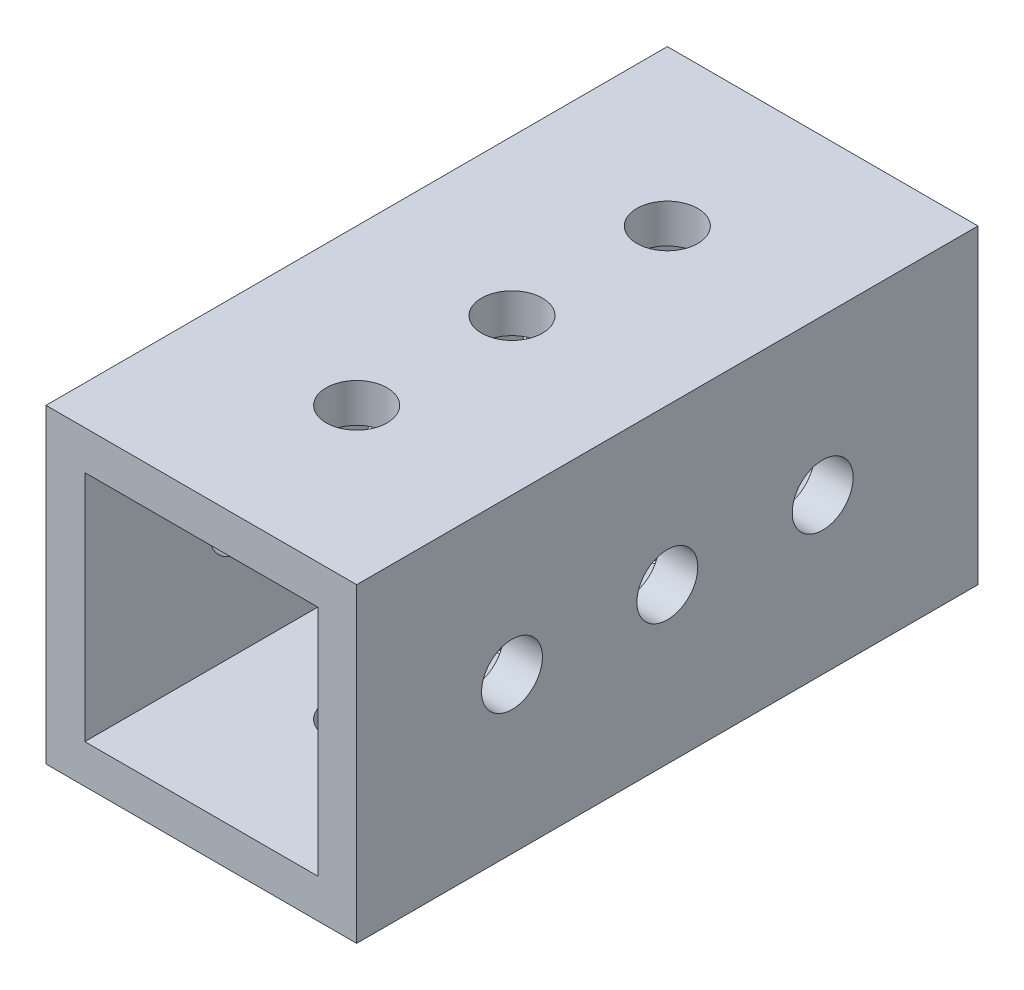
ISO-10303-21;
HEADER;
FILE_DESCRIPTION(('STEP AP214'),'2;1');
FILE_NAME('part.step','',(''),(''),'','','');
FILE_SCHEMA(('AUTOMOTIVE_DESIGN { 1 0 10303 214 1 1 1 1 }'));
ENDSEC;
DATA;
#1=APPLICATION_CONTEXT('core data for automotive mechanical design processes');
#2=APPLICATION_PROTOCOL_DEFINITION('international standard','automotive_design',2000,#1);
#3=PRODUCT_CONTEXT('',#1,'mechanical');
#4=PRODUCT('Part','Part','',(#3));
#5=PRODUCT_RELATED_PRODUCT_CATEGORY('part','',(#4));
#6=PRODUCT_DEFINITION_FORMATION('','',#4);
#7=PRODUCT_DEFINITION_CONTEXT('part definition',#1,'design');
#8=PRODUCT_DEFINITION('design','',#6,#7);
#9=PRODUCT_DEFINITION_SHAPE('','',#8);
#10=(LENGTH_UNIT() NAMED_UNIT(*) SI_UNIT(.MILLI.,.METRE.));
#11=(NAMED_UNIT(*) PLANE_ANGLE_UNIT() SI_UNIT($,.RADIAN.));
#12=(NAMED_UNIT(*) SI_UNIT($,.STERADIAN.) SOLID_ANGLE_UNIT());
#13=UNCERTAINTY_MEASURE_WITH_UNIT(LENGTH_MEASURE(1.E-05),#10,'distance_accuracy_value','');
#14=(GEOMETRIC_REPRESENTATION_CONTEXT(3) GLOBAL_UNCERTAINTY_ASSIGNED_CONTEXT((#13)) GLOBAL_UNIT_ASSIGNED_CONTEXT((#10,
#11,#12)) REPRESENTATION_CONTEXT('',''));
#15=CARTESIAN_POINT('',(0.,0.,0.));
#16=DIRECTION('',(0.,0.,1.));
#17=DIRECTION('',(1.,0.,0.));
#18=AXIS2_PLACEMENT_3D('',#15,#16,#17);
#19=CARTESIAN_POINT('',(139.7,169.926,-50.8));
#20=DIRECTION('',(-1.,0.,0.));
#21=DIRECTION('',(0.,0.,1.));
#22=AXIS2_PLACEMENT_3D('',#19,#20,#21);
#23=PLANE('',#22);
#24=CARTESIAN_POINT('',(139.7,157.226,-12.7));
#25=DIRECTION('',(1.,0.,0.));
#26=DIRECTION('',(0.,0.,-1.));
#27=AXIS2_PLACEMENT_3D('',#24,#25,#26);
#28=CIRCLE('',#27,2.48920000000001);
#29=CARTESIAN_POINT('',(139.7,157.226,-15.1892));
#30=VERTEX_POINT('',#29);
#31=EDGE_CURVE('E176',#30,#30,#28,.T.);
#32=ORIENTED_EDGE('',*,*,#31,.T.);
#33=EDGE_LOOP('',(#32));
#34=FACE_BOUND('',#33,.T.);
#35=CARTESIAN_POINT('',(139.7,157.226,-25.4));
#36=DIRECTION('',(1.,0.,0.));
#37=DIRECTION('',(0.,0.,-1.));
#38=AXIS2_PLACEMENT_3D('',#35,#36,#37);
#39=CIRCLE('',#38,2.48920000000001);
#40=CARTESIAN_POINT('',(139.7,157.226,-27.8892));
#41=VERTEX_POINT('',#40);
#42=EDGE_CURVE('E219',#41,#41,#39,.T.);
#43=ORIENTED_EDGE('',*,*,#42,.T.);
#44=EDGE_LOOP('',(#43));
#45=FACE_BOUND('',#44,.T.);
#46=CARTESIAN_POINT('',(139.7,157.226,-38.1));
#47=DIRECTION('',(1.,0.,0.));
#48=DIRECTION('',(0.,0.,-1.));
#49=AXIS2_PLACEMENT_3D('',#46,#47,#48);
#50=CIRCLE('',#49,2.48920000000001);
#51=CARTESIAN_POINT('',(139.7,157.226,-40.5892));
#52=VERTEX_POINT('',#51);
#53=EDGE_CURVE('E216',#52,#52,#50,.T.);
#54=ORIENTED_EDGE('',*,*,#53,.T.);
#55=EDGE_LOOP('',(#54));
#56=FACE_BOUND('',#55,.T.);
#57=DIRECTION('',(0.,-1.,0.));
#58=VECTOR('',#57,1.);
#59=CARTESIAN_POINT('',(139.7,169.926,0.));
#60=LINE('',#59,#58);
#61=CARTESIAN_POINT('',(139.7,169.926,0.));
#62=VERTEX_POINT('',#61);
#63=CARTESIAN_POINT('',(139.7,144.526,0.));
#64=VERTEX_POINT('',#63);
#65=EDGE_CURVE('E157',#62,#64,#60,.T.);
#66=ORIENTED_EDGE('',*,*,#65,.F.);
#67=DIRECTION('',(0.,0.,1.));
#68=VECTOR('',#67,1.);
#69=CARTESIAN_POINT('',(139.7,169.926,-50.8));
#70=LINE('',#69,#68);
#71=CARTESIAN_POINT('',(139.7,169.926,-50.8));
#72=VERTEX_POINT('',#71);
#73=EDGE_CURVE('E11',#72,#62,#70,.T.);
#74=ORIENTED_EDGE('',*,*,#73,.F.);
#75=DIRECTION('',(0.,-1.,0.));
#76=VECTOR('',#75,1.);
#77=CARTESIAN_POINT('',(139.7,169.926,-50.8));
#78=LINE('',#77,#76);
#79=CARTESIAN_POINT('',(139.7,144.526,-50.8));
#80=VERTEX_POINT('',#79);
#81=EDGE_CURVE('E143',#72,#80,#78,.T.);
#82=ORIENTED_EDGE('',*,*,#81,.T.);
#83=DIRECTION('',(0.,0.,1.));
#84=VECTOR('',#83,1.);
#85=CARTESIAN_POINT('',(139.7,144.526,-50.8));
#86=LINE('',#85,#84);
#87=EDGE_CURVE('E156',#80,#64,#86,.T.);
#88=ORIENTED_EDGE('',*,*,#87,.T.);
#89=EDGE_LOOP('',(#66,#74,#82,#88));
#90=FACE_BOUND('',#89,.T.);
#91=ADVANCED_FACE('F43',(#34,#45,#56,#90),#23,.T.);
#92=CARTESIAN_POINT('',(139.7,169.926,-50.8));
#93=DIRECTION('',(0.,1.,0.));
#94=DIRECTION('',(0.,0.,1.));
#95=AXIS2_PLACEMENT_3D('',#92,#93,#94);
#96=PLANE('',#95);
#97=CARTESIAN_POINT('',(152.4,169.926,-12.7));
#98=DIRECTION('',(0.,1.,0.));
#99=DIRECTION('',(0.,0.,1.));
#100=AXIS2_PLACEMENT_3D('',#97,#98,#99);
#101=CIRCLE('',#100,2.4892);
#102=CARTESIAN_POINT('',(152.4,169.926,-10.2108));
#103=VERTEX_POINT('',#102);
#104=EDGE_CURVE('E213',#103,#103,#101,.T.);
#105=ORIENTED_EDGE('',*,*,#104,.F.);
#106=EDGE_LOOP('',(#105));
#107=FACE_BOUND('',#106,.T.);
#108=CARTESIAN_POINT('',(152.4,169.926,-25.4));
#109=DIRECTION('',(0.,1.,0.));
#110=DIRECTION('',(0.,0.,1.));
#111=AXIS2_PLACEMENT_3D('',#108,#109,#110);
#112=CIRCLE('',#111,2.4892);
#113=CARTESIAN_POINT('',(152.4,169.926,-22.9108));
#114=VERTEX_POINT('',#113);
#115=EDGE_CURVE('E198',#114,#114,#112,.T.);
#116=ORIENTED_EDGE('',*,*,#115,.F.);
#117=EDGE_LOOP('',(#116));
#118=FACE_BOUND('',#117,.T.);
#119=CARTESIAN_POINT('',(152.4,169.926,-38.1));
#120=DIRECTION('',(0.,1.,0.));
#121=DIRECTION('',(0.,0.,1.));
#122=AXIS2_PLACEMENT_3D('',#119,#120,#121);
#123=CIRCLE('',#122,2.4892);
#124=CARTESIAN_POINT('',(152.4,169.926,-35.6108));
#125=VERTEX_POINT('',#124);
#126=EDGE_CURVE('E194',#125,#125,#123,.T.);
#127=ORIENTED_EDGE('',*,*,#126,.F.);
#128=EDGE_LOOP('',(#127));
#129=FACE_BOUND('',#128,.T.);
#130=DIRECTION('',(-1.,0.,0.));
#131=VECTOR('',#130,1.);
#132=CARTESIAN_POINT('',(139.7,169.926,0.));
#133=LINE('',#132,#131);
#134=CARTESIAN_POINT('',(165.1,169.926,0.));
#135=VERTEX_POINT('',#134);
#136=EDGE_CURVE('E147',#135,#62,#133,.T.);
#137=ORIENTED_EDGE('',*,*,#136,.F.);
#138=DIRECTION('',(0.,0.,1.));
#139=VECTOR('',#138,1.);
#140=CARTESIAN_POINT('',(165.1,169.926,-50.8));
#141=LINE('',#140,#139);
#142=CARTESIAN_POINT('',(165.1,169.926,-50.8));
#143=VERTEX_POINT('',#142);
#144=EDGE_CURVE('E51',#143,#135,#141,.T.);
#145=ORIENTED_EDGE('',*,*,#144,.F.);
#146=DIRECTION('',(-1.,0.,0.));
#147=VECTOR('',#146,1.);
#148=CARTESIAN_POINT('',(139.7,169.926,-50.8));
#149=LINE('',#148,#147);
#150=EDGE_CURVE('E153',#143,#72,#149,.T.);
#151=ORIENTED_EDGE('',*,*,#150,.T.);
#152=ORIENTED_EDGE('',*,*,#73,.T.);
#153=EDGE_LOOP('',(#137,#145,#151,#152));
#154=FACE_BOUND('',#153,.T.);
#155=ADVANCED_FACE('F260',(#107,#118,#129,#154),#96,.T.);
#156=CARTESIAN_POINT('',(165.1,169.926,-50.8));
#157=DIRECTION('',(1.,0.,0.));
#158=DIRECTION('',(0.,0.,-1.));
#159=AXIS2_PLACEMENT_3D('',#156,#157,#158);
#160=PLANE('',#159);
#161=CARTESIAN_POINT('',(165.1,157.226,-12.7));
#162=DIRECTION('',(1.,0.,0.));
#163=DIRECTION('',(0.,0.,-1.));
#164=AXIS2_PLACEMENT_3D('',#161,#162,#163);
#165=CIRCLE('',#164,2.48920000000001);
#166=CARTESIAN_POINT('',(165.1,157.226,-15.1892));
#167=VERTEX_POINT('',#166);
#168=EDGE_CURVE('E127',#167,#167,#165,.T.);
#169=ORIENTED_EDGE('',*,*,#168,.F.);
#170=EDGE_LOOP('',(#169));
#171=FACE_BOUND('',#170,.T.);
#172=CARTESIAN_POINT('',(165.1,157.226,-25.4));
#173=DIRECTION('',(1.,0.,0.));
#174=DIRECTION('',(0.,0.,-1.));
#175=AXIS2_PLACEMENT_3D('',#172,#173,#174);
#176=CIRCLE('',#175,2.48920000000001);
#177=CARTESIAN_POINT('',(165.1,157.226,-27.8892));
#178=VERTEX_POINT('',#177);
#179=EDGE_CURVE('E186',#178,#178,#176,.T.);
#180=ORIENTED_EDGE('',*,*,#179,.F.);
#181=EDGE_LOOP('',(#180));
#182=FACE_BOUND('',#181,.T.);
#183=CARTESIAN_POINT('',(165.1,157.226,-38.1));
#184=DIRECTION('',(1.,0.,0.));
#185=DIRECTION('',(0.,0.,-1.));
#186=AXIS2_PLACEMENT_3D('',#183,#184,#185);
#187=CIRCLE('',#186,2.48920000000001);
#188=CARTESIAN_POINT('',(165.1,157.226,-40.5892));
#189=VERTEX_POINT('',#188);
#190=EDGE_CURVE('E181',#189,#189,#187,.T.);
#191=ORIENTED_EDGE('',*,*,#190,.F.);
#192=EDGE_LOOP('',(#191));
#193=FACE_BOUND('',#192,.T.);
#194=DIRECTION('',(0.,1.,0.));
#195=VECTOR('',#194,1.);
#196=CARTESIAN_POINT('',(165.1,169.926,0.));
#197=LINE('',#196,#195);
#198=CARTESIAN_POINT('',(165.1,144.526,0.));
#199=VERTEX_POINT('',#198);
#200=EDGE_CURVE('E163',#199,#135,#197,.T.);
#201=ORIENTED_EDGE('',*,*,#200,.F.);
#202=DIRECTION('',(0.,0.,1.));
#203=VECTOR('',#202,1.);
#204=CARTESIAN_POINT('',(165.1,144.526,-50.8));
#205=LINE('',#204,#203);
#206=CARTESIAN_POINT('',(165.1,144.526,-50.8));
#207=VERTEX_POINT('',#206);
#208=EDGE_CURVE('E169',#207,#199,#205,.T.);
#209=ORIENTED_EDGE('',*,*,#208,.F.);
#210=DIRECTION('',(0.,1.,0.));
#211=VECTOR('',#210,1.);
#212=CARTESIAN_POINT('',(165.1,169.926,-50.8));
#213=LINE('',#212,#211);
#214=EDGE_CURVE('E150',#207,#143,#213,.T.);
#215=ORIENTED_EDGE('',*,*,#214,.T.);
#216=ORIENTED_EDGE('',*,*,#144,.T.);
#217=EDGE_LOOP('',(#201,#209,#215,#216));
#218=FACE_BOUND('',#217,.T.);
#219=ADVANCED_FACE('F267',(#171,#182,#193,#218),#160,.T.);
#220=CARTESIAN_POINT('',(139.7,144.526,-50.8));
#221=DIRECTION('',(0.,-1.,0.));
#222=DIRECTION('',(0.,0.,-1.));
#223=AXIS2_PLACEMENT_3D('',#220,#221,#222);
#224=PLANE('',#223);
#225=CARTESIAN_POINT('',(152.4,144.526,-12.7));
#226=DIRECTION('',(0.,1.,0.));
#227=DIRECTION('',(0.,0.,1.));
#228=AXIS2_PLACEMENT_3D('',#225,#226,#227);
#229=CIRCLE('',#228,2.4892);
#230=CARTESIAN_POINT('',(152.4,144.526,-10.2108));
#231=VERTEX_POINT('',#230);
#232=EDGE_CURVE('E190',#231,#231,#229,.T.);
#233=ORIENTED_EDGE('',*,*,#232,.T.);
#234=EDGE_LOOP('',(#233));
#235=FACE_BOUND('',#234,.T.);
#236=CARTESIAN_POINT('',(152.4,144.526,-25.4));
#237=DIRECTION('',(0.,1.,0.));
#238=DIRECTION('',(0.,0.,1.));
#239=AXIS2_PLACEMENT_3D('',#236,#237,#238);
#240=CIRCLE('',#239,2.4892);
#241=CARTESIAN_POINT('',(152.4,144.526,-22.9108));
#242=VERTEX_POINT('',#241);
#243=EDGE_CURVE('E504',#242,#242,#240,.T.);
#244=ORIENTED_EDGE('',*,*,#243,.T.);
#245=EDGE_LOOP('',(#244));
#246=FACE_BOUND('',#245,.T.);
#247=CARTESIAN_POINT('',(152.4,144.526,-38.1));
#248=DIRECTION('',(0.,1.,0.));
#249=DIRECTION('',(0.,0.,1.));
#250=AXIS2_PLACEMENT_3D('',#247,#248,#249);
#251=CIRCLE('',#250,2.4892);
#252=CARTESIAN_POINT('',(152.4,144.526,-35.6108));
#253=VERTEX_POINT('',#252);
#254=EDGE_CURVE('E507',#253,#253,#251,.T.);
#255=ORIENTED_EDGE('',*,*,#254,.T.);
#256=EDGE_LOOP('',(#255));
#257=FACE_BOUND('',#256,.T.);
#258=DIRECTION('',(1.,0.,0.));
#259=VECTOR('',#258,1.);
#260=CARTESIAN_POINT('',(139.7,144.526,0.));
#261=LINE('',#260,#259);
#262=EDGE_CURVE('E160',#64,#199,#261,.T.);
#263=ORIENTED_EDGE('',*,*,#262,.F.);
#264=ORIENTED_EDGE('',*,*,#87,.F.);
#265=DIRECTION('',(1.,0.,0.));
#266=VECTOR('',#265,1.);
#267=CARTESIAN_POINT('',(139.7,144.526,-50.8));
#268=LINE('',#267,#266);
#269=EDGE_CURVE('E146',#80,#207,#268,.T.);
#270=ORIENTED_EDGE('',*,*,#269,.T.);
#271=ORIENTED_EDGE('',*,*,#208,.T.);
#272=EDGE_LOOP('',(#263,#264,#270,#271));
#273=FACE_BOUND('',#272,.T.);
#274=ADVANCED_FACE('F286',(#235,#246,#257,#273),#224,.T.);
#275=CARTESIAN_POINT('',(0.,0.,-50.8));
#276=DIRECTION('',(0.,0.,1.));
#277=DIRECTION('',(1.,0.,0.));
#278=AXIS2_PLACEMENT_3D('',#275,#276,#277);
#279=PLANE('',#278);
#280=DIRECTION('',(-1.,0.,0.));
#281=VECTOR('',#280,1.);
#282=CARTESIAN_POINT('',(0.,166.751,-50.8));
#283=LINE('',#282,#281);
#284=CARTESIAN_POINT('',(161.925,166.751,-50.8));
#285=VERTEX_POINT('',#284);
#286=CARTESIAN_POINT('',(142.875,166.751,-50.8));
#287=VERTEX_POINT('',#286);
#288=EDGE_CURVE('E118',#285,#287,#283,.T.);
#289=ORIENTED_EDGE('',*,*,#288,.T.);
#290=DIRECTION('',(0.,-1.,0.));
#291=VECTOR('',#290,1.);
#292=CARTESIAN_POINT('',(142.875,0.,-50.8));
#293=LINE('',#292,#291);
#294=CARTESIAN_POINT('',(142.875,147.701,-50.8));
#295=VERTEX_POINT('',#294);
#296=EDGE_CURVE('E137',#287,#295,#293,.T.);
#297=ORIENTED_EDGE('',*,*,#296,.T.);
#298=DIRECTION('',(1.,0.,0.));
#299=VECTOR('',#298,1.);
#300=CARTESIAN_POINT('',(0.,147.701,-50.8));
#301=LINE('',#300,#299);
#302=CARTESIAN_POINT('',(161.925,147.701,-50.8));
#303=VERTEX_POINT('',#302);
#304=EDGE_CURVE('E113',#295,#303,#301,.T.);
#305=ORIENTED_EDGE('',*,*,#304,.T.);
#306=DIRECTION('',(0.,1.,0.));
#307=VECTOR('',#306,1.);
#308=CARTESIAN_POINT('',(161.925,0.,-50.8));
#309=LINE('',#308,#307);
#310=EDGE_CURVE('E59',#303,#285,#309,.T.);
#311=ORIENTED_EDGE('',*,*,#310,.T.);
#312=EDGE_LOOP('',(#289,#297,#305,#311));
#313=FACE_BOUND('',#312,.T.);
#314=ORIENTED_EDGE('',*,*,#81,.F.);
#315=ORIENTED_EDGE('',*,*,#150,.F.);
#316=ORIENTED_EDGE('',*,*,#214,.F.);
#317=ORIENTED_EDGE('',*,*,#269,.F.);
#318=EDGE_LOOP('',(#314,#315,#316,#317));
#319=FACE_BOUND('',#318,.T.);
#320=ADVANCED_FACE('F240',(#313,#319),#279,.F.);
#321=CARTESIAN_POINT('',(0.,0.,0.));
#322=DIRECTION('',(0.,0.,1.));
#323=DIRECTION('',(1.,0.,0.));
#324=AXIS2_PLACEMENT_3D('',#321,#322,#323);
#325=PLANE('',#324);
#326=DIRECTION('',(0.,-1.,0.));
#327=VECTOR('',#326,1.);
#328=CARTESIAN_POINT('',(142.875,0.,0.));
#329=LINE('',#328,#327);
#330=CARTESIAN_POINT('',(142.875,166.751,0.));
#331=VERTEX_POINT('',#330);
#332=CARTESIAN_POINT('',(142.875,147.701,0.));
#333=VERTEX_POINT('',#332);
#334=EDGE_CURVE('E121',#331,#333,#329,.T.);
#335=ORIENTED_EDGE('',*,*,#334,.F.);
#336=DIRECTION('',(-1.,0.,0.));
#337=VECTOR('',#336,1.);
#338=CARTESIAN_POINT('',(0.,166.751,0.));
#339=LINE('',#338,#337);
#340=CARTESIAN_POINT('',(161.925,166.751,0.));
#341=VERTEX_POINT('',#340);
#342=EDGE_CURVE('E132',#341,#331,#339,.T.);
#343=ORIENTED_EDGE('',*,*,#342,.F.);
#344=DIRECTION('',(0.,1.,0.));
#345=VECTOR('',#344,1.);
#346=CARTESIAN_POINT('',(161.925,0.,0.));
#347=LINE('',#346,#345);
#348=CARTESIAN_POINT('',(161.925,147.701,0.));
#349=VERTEX_POINT('',#348);
#350=EDGE_CURVE('E64',#349,#341,#347,.T.);
#351=ORIENTED_EDGE('',*,*,#350,.F.);
#352=DIRECTION('',(1.,0.,0.));
#353=VECTOR('',#352,1.);
#354=CARTESIAN_POINT('',(0.,147.701,0.));
#355=LINE('',#354,#353);
#356=EDGE_CURVE('E111',#333,#349,#355,.T.);
#357=ORIENTED_EDGE('',*,*,#356,.F.);
#358=EDGE_LOOP('',(#335,#343,#351,#357));
#359=FACE_BOUND('',#358,.T.);
#360=ORIENTED_EDGE('',*,*,#65,.T.);
#361=ORIENTED_EDGE('',*,*,#262,.T.);
#362=ORIENTED_EDGE('',*,*,#200,.T.);
#363=ORIENTED_EDGE('',*,*,#136,.T.);
#364=EDGE_LOOP('',(#360,#361,#362,#363));
#365=FACE_BOUND('',#364,.T.);
#366=ADVANCED_FACE('F129',(#359,#365),#325,.T.);
#367=CARTESIAN_POINT('',(142.875,169.926,-50.8));
#368=DIRECTION('',(-1.,0.,0.));
#369=DIRECTION('',(0.,0.,1.));
#370=AXIS2_PLACEMENT_3D('',#367,#368,#369);
#371=PLANE('',#370);
#372=CARTESIAN_POINT('',(142.875,157.226,-12.7));
#373=DIRECTION('',(-1.,0.,0.));
#374=DIRECTION('',(0.,0.,1.));
#375=AXIS2_PLACEMENT_3D('',#372,#373,#374);
#376=CIRCLE('',#375,2.48920000000001);
#377=CARTESIAN_POINT('',(142.875,157.226,-10.2108));
#378=VERTEX_POINT('',#377);
#379=EDGE_CURVE('E185',#378,#378,#376,.T.);
#380=ORIENTED_EDGE('',*,*,#379,.T.);
#381=EDGE_LOOP('',(#380));
#382=FACE_BOUND('',#381,.T.);
#383=CARTESIAN_POINT('',(142.875,157.226,-25.4));
#384=DIRECTION('',(-1.,0.,0.));
#385=DIRECTION('',(0.,0.,1.));
#386=AXIS2_PLACEMENT_3D('',#383,#384,#385);
#387=CIRCLE('',#386,2.48920000000001);
#388=CARTESIAN_POINT('',(142.875,157.226,-22.9108));
#389=VERTEX_POINT('',#388);
#390=EDGE_CURVE('E180',#389,#389,#387,.T.);
#391=ORIENTED_EDGE('',*,*,#390,.T.);
#392=EDGE_LOOP('',(#391));
#393=FACE_BOUND('',#392,.T.);
#394=CARTESIAN_POINT('',(142.875,157.226,-38.1));
#395=DIRECTION('',(-1.,0.,0.));
#396=DIRECTION('',(0.,0.,1.));
#397=AXIS2_PLACEMENT_3D('',#394,#395,#396);
#398=CIRCLE('',#397,2.48920000000001);
#399=CARTESIAN_POINT('',(142.875,157.226,-35.6108));
#400=VERTEX_POINT('',#399);
#401=EDGE_CURVE('E175',#400,#400,#398,.T.);
#402=ORIENTED_EDGE('',*,*,#401,.T.);
#403=EDGE_LOOP('',(#402));
#404=FACE_BOUND('',#403,.T.);
#405=ORIENTED_EDGE('',*,*,#334,.T.);
#406=DIRECTION('',(0.,0.,1.));
#407=VECTOR('',#406,1.);
#408=CARTESIAN_POINT('',(142.875,147.701,-50.8));
#409=LINE('',#408,#407);
#410=EDGE_CURVE('E107',#295,#333,#409,.T.);
#411=ORIENTED_EDGE('',*,*,#410,.F.);
#412=ORIENTED_EDGE('',*,*,#296,.F.);
#413=DIRECTION('',(0.,0.,1.));
#414=VECTOR('',#413,1.);
#415=CARTESIAN_POINT('',(142.875,166.751,-50.8));
#416=LINE('',#415,#414);
#417=EDGE_CURVE('E123',#287,#331,#416,.T.);
#418=ORIENTED_EDGE('',*,*,#417,.T.);
#419=EDGE_LOOP('',(#405,#411,#412,#418));
#420=FACE_BOUND('',#419,.T.);
#421=ADVANCED_FACE('F122',(#382,#393,#404,#420),#371,.F.);
#422=CARTESIAN_POINT('',(139.7,166.751,-50.8));
#423=DIRECTION('',(0.,1.,0.));
#424=DIRECTION('',(0.,0.,1.));
#425=AXIS2_PLACEMENT_3D('',#422,#423,#424);
#426=PLANE('',#425);
#427=CARTESIAN_POINT('',(152.4,166.751,-12.7));
#428=DIRECTION('',(0.,1.,0.));
#429=DIRECTION('',(0.,0.,1.));
#430=AXIS2_PLACEMENT_3D('',#427,#428,#429);
#431=CIRCLE('',#430,2.4892);
#432=CARTESIAN_POINT('',(152.4,166.751,-10.2108));
#433=VERTEX_POINT('',#432);
#434=EDGE_CURVE('E210',#433,#433,#431,.T.);
#435=ORIENTED_EDGE('',*,*,#434,.T.);
#436=EDGE_LOOP('',(#435));
#437=FACE_BOUND('',#436,.T.);
#438=CARTESIAN_POINT('',(152.4,166.751,-25.4));
#439=DIRECTION('',(0.,1.,0.));
#440=DIRECTION('',(0.,0.,1.));
#441=AXIS2_PLACEMENT_3D('',#438,#439,#440);
#442=CIRCLE('',#441,2.4892);
#443=CARTESIAN_POINT('',(152.4,166.751,-22.9108));
#444=VERTEX_POINT('',#443);
#445=EDGE_CURVE('E193',#444,#444,#442,.T.);
#446=ORIENTED_EDGE('',*,*,#445,.T.);
#447=EDGE_LOOP('',(#446));
#448=FACE_BOUND('',#447,.T.);
#449=CARTESIAN_POINT('',(152.4,166.751,-38.1));
#450=DIRECTION('',(0.,1.,0.));
#451=DIRECTION('',(0.,0.,1.));
#452=AXIS2_PLACEMENT_3D('',#449,#450,#451);
#453=CIRCLE('',#452,2.4892);
#454=CARTESIAN_POINT('',(152.4,166.751,-35.6108));
#455=VERTEX_POINT('',#454);
#456=EDGE_CURVE('E189',#455,#455,#453,.T.);
#457=ORIENTED_EDGE('',*,*,#456,.T.);
#458=EDGE_LOOP('',(#457));
#459=FACE_BOUND('',#458,.T.);
#460=ORIENTED_EDGE('',*,*,#342,.T.);
#461=ORIENTED_EDGE('',*,*,#417,.F.);
#462=ORIENTED_EDGE('',*,*,#288,.F.);
#463=DIRECTION('',(0.,0.,1.));
#464=VECTOR('',#463,1.);
#465=CARTESIAN_POINT('',(161.925,166.751,-50.8));
#466=LINE('',#465,#464);
#467=EDGE_CURVE('E236',#285,#341,#466,.T.);
#468=ORIENTED_EDGE('',*,*,#467,.T.);
#469=EDGE_LOOP('',(#460,#461,#462,#468));
#470=FACE_BOUND('',#469,.T.);
#471=ADVANCED_FACE('F244',(#437,#448,#459,#470),#426,.F.);
#472=CARTESIAN_POINT('',(161.925,169.926,-50.8));
#473=DIRECTION('',(1.,0.,0.));
#474=DIRECTION('',(0.,0.,-1.));
#475=AXIS2_PLACEMENT_3D('',#472,#473,#474);
#476=PLANE('',#475);
#477=CARTESIAN_POINT('',(161.925,157.226,-12.7));
#478=DIRECTION('',(1.,0.,0.));
#479=DIRECTION('',(0.,0.,-1.));
#480=AXIS2_PLACEMENT_3D('',#477,#478,#479);
#481=CIRCLE('',#480,2.48920000000001);
#482=CARTESIAN_POINT('',(161.925,157.226,-15.1892));
#483=VERTEX_POINT('',#482);
#484=EDGE_CURVE('E182',#483,#483,#481,.T.);
#485=ORIENTED_EDGE('',*,*,#484,.T.);
#486=EDGE_LOOP('',(#485));
#487=FACE_BOUND('',#486,.T.);
#488=CARTESIAN_POINT('',(161.925,157.226,-25.4));
#489=DIRECTION('',(1.,0.,0.));
#490=DIRECTION('',(0.,0.,-1.));
#491=AXIS2_PLACEMENT_3D('',#488,#489,#490);
#492=CIRCLE('',#491,2.48920000000001);
#493=CARTESIAN_POINT('',(161.925,157.226,-27.8892));
#494=VERTEX_POINT('',#493);
#495=EDGE_CURVE('E177',#494,#494,#492,.T.);
#496=ORIENTED_EDGE('',*,*,#495,.T.);
#497=EDGE_LOOP('',(#496));
#498=FACE_BOUND('',#497,.T.);
#499=CARTESIAN_POINT('',(161.925,157.226,-38.1));
#500=DIRECTION('',(1.,0.,0.));
#501=DIRECTION('',(0.,0.,-1.));
#502=AXIS2_PLACEMENT_3D('',#499,#500,#501);
#503=CIRCLE('',#502,2.48920000000001);
#504=CARTESIAN_POINT('',(161.925,157.226,-40.5892));
#505=VERTEX_POINT('',#504);
#506=EDGE_CURVE('E172',#505,#505,#503,.T.);
#507=ORIENTED_EDGE('',*,*,#506,.T.);
#508=EDGE_LOOP('',(#507));
#509=FACE_BOUND('',#508,.T.);
#510=ORIENTED_EDGE('',*,*,#350,.T.);
#511=ORIENTED_EDGE('',*,*,#467,.F.);
#512=ORIENTED_EDGE('',*,*,#310,.F.);
#513=DIRECTION('',(0.,0.,1.));
#514=VECTOR('',#513,1.);
#515=CARTESIAN_POINT('',(161.925,147.701,-50.8));
#516=LINE('',#515,#514);
#517=EDGE_CURVE('E117',#303,#349,#516,.T.);
#518=ORIENTED_EDGE('',*,*,#517,.T.);
#519=EDGE_LOOP('',(#510,#511,#512,#518));
#520=FACE_BOUND('',#519,.T.);
#521=ADVANCED_FACE('F238',(#487,#498,#509,#520),#476,.F.);
#522=CARTESIAN_POINT('',(139.7,147.701,-50.8));
#523=DIRECTION('',(0.,-1.,0.));
#524=DIRECTION('',(0.,0.,-1.));
#525=AXIS2_PLACEMENT_3D('',#522,#523,#524);
#526=PLANE('',#525);
#527=CARTESIAN_POINT('',(152.4,147.701,-12.7));
#528=DIRECTION('',(0.,-1.,0.));
#529=DIRECTION('',(0.,0.,-1.));
#530=AXIS2_PLACEMENT_3D('',#527,#528,#529);
#531=CIRCLE('',#530,2.4892);
#532=CARTESIAN_POINT('',(152.4,147.701,-15.1892));
#533=VERTEX_POINT('',#532);
#534=EDGE_CURVE('E46',#533,#533,#531,.T.);
#535=ORIENTED_EDGE('',*,*,#534,.T.);
#536=EDGE_LOOP('',(#535));
#537=FACE_BOUND('',#536,.T.);
#538=CARTESIAN_POINT('',(152.4,147.701,-25.4));
#539=DIRECTION('',(0.,-1.,0.));
#540=DIRECTION('',(0.,0.,-1.));
#541=AXIS2_PLACEMENT_3D('',#538,#539,#540);
#542=CIRCLE('',#541,2.4892);
#543=CARTESIAN_POINT('',(152.4,147.701,-27.8892));
#544=VERTEX_POINT('',#543);
#545=EDGE_CURVE('E191',#544,#544,#542,.T.);
#546=ORIENTED_EDGE('',*,*,#545,.T.);
#547=EDGE_LOOP('',(#546));
#548=FACE_BOUND('',#547,.T.);
#549=CARTESIAN_POINT('',(152.4,147.701,-38.1));
#550=DIRECTION('',(0.,-1.,0.));
#551=DIRECTION('',(0.,0.,-1.));
#552=AXIS2_PLACEMENT_3D('',#549,#550,#551);
#553=CIRCLE('',#552,2.4892);
#554=CARTESIAN_POINT('',(152.4,147.701,-40.5892));
#555=VERTEX_POINT('',#554);
#556=EDGE_CURVE('E187',#555,#555,#553,.T.);
#557=ORIENTED_EDGE('',*,*,#556,.T.);
#558=EDGE_LOOP('',(#557));
#559=FACE_BOUND('',#558,.T.);
#560=ORIENTED_EDGE('',*,*,#356,.T.);
#561=ORIENTED_EDGE('',*,*,#517,.F.);
#562=ORIENTED_EDGE('',*,*,#304,.F.);
#563=ORIENTED_EDGE('',*,*,#410,.T.);
#564=EDGE_LOOP('',(#560,#561,#562,#563));
#565=FACE_BOUND('',#564,.T.);
#566=ADVANCED_FACE('F109',(#537,#548,#559,#565),#526,.F.);
#567=CARTESIAN_POINT('',(139.7,157.226,-38.1));
#568=DIRECTION('',(1.,0.,0.));
#569=DIRECTION('',(0.,0.,-1.));
#570=AXIS2_PLACEMENT_3D('',#567,#568,#569);
#571=CYLINDRICAL_SURFACE('',#570,2.48920000000001);
#572=ORIENTED_EDGE('',*,*,#190,.T.);
#573=EDGE_LOOP('',(#572));
#574=FACE_BOUND('',#573,.T.);
#575=ORIENTED_EDGE('',*,*,#506,.F.);
#576=EDGE_LOOP('',(#575));
#577=FACE_BOUND('',#576,.T.);
#578=ADVANCED_FACE('F299',(#574,#577),#571,.F.);
#579=CARTESIAN_POINT('',(139.7,157.226,-25.4));
#580=DIRECTION('',(1.,0.,0.));
#581=DIRECTION('',(0.,0.,-1.));
#582=AXIS2_PLACEMENT_3D('',#579,#580,#581);
#583=CYLINDRICAL_SURFACE('',#582,2.48920000000001);
#584=ORIENTED_EDGE('',*,*,#179,.T.);
#585=EDGE_LOOP('',(#584));
#586=FACE_BOUND('',#585,.T.);
#587=ORIENTED_EDGE('',*,*,#495,.F.);
#588=EDGE_LOOP('',(#587));
#589=FACE_BOUND('',#588,.T.);
#590=ADVANCED_FACE('F305',(#586,#589),#583,.F.);
#591=CARTESIAN_POINT('',(139.7,157.226,-12.7));
#592=DIRECTION('',(1.,0.,0.));
#593=DIRECTION('',(0.,0.,-1.));
#594=AXIS2_PLACEMENT_3D('',#591,#592,#593);
#595=CYLINDRICAL_SURFACE('',#594,2.48920000000001);
#596=ORIENTED_EDGE('',*,*,#168,.T.);
#597=EDGE_LOOP('',(#596));
#598=FACE_BOUND('',#597,.T.);
#599=ORIENTED_EDGE('',*,*,#484,.F.);
#600=EDGE_LOOP('',(#599));
#601=FACE_BOUND('',#600,.T.);
#602=ADVANCED_FACE('F331',(#598,#601),#595,.F.);
#603=ORIENTED_EDGE('',*,*,#53,.F.);
#604=EDGE_LOOP('',(#603));
#605=FACE_BOUND('',#604,.T.);
#606=ORIENTED_EDGE('',*,*,#401,.F.);
#607=EDGE_LOOP('',(#606));
#608=FACE_BOUND('',#607,.T.);
#609=ADVANCED_FACE('F308',(#605,#608),#571,.F.);
#610=ORIENTED_EDGE('',*,*,#42,.F.);
#611=EDGE_LOOP('',(#610));
#612=FACE_BOUND('',#611,.T.);
#613=ORIENTED_EDGE('',*,*,#390,.F.);
#614=EDGE_LOOP('',(#613));
#615=FACE_BOUND('',#614,.T.);
#616=ADVANCED_FACE('F328',(#612,#615),#583,.F.);
#617=ORIENTED_EDGE('',*,*,#31,.F.);
#618=EDGE_LOOP('',(#617));
#619=FACE_BOUND('',#618,.T.);
#620=ORIENTED_EDGE('',*,*,#379,.F.);
#621=EDGE_LOOP('',(#620));
#622=FACE_BOUND('',#621,.T.);
#623=ADVANCED_FACE('F316',(#619,#622),#595,.F.);
#624=CARTESIAN_POINT('',(152.4,144.526,-38.1));
#625=DIRECTION('',(0.,1.,0.));
#626=DIRECTION('',(0.,0.,1.));
#627=AXIS2_PLACEMENT_3D('',#624,#625,#626);
#628=CYLINDRICAL_SURFACE('',#627,2.4892);
#629=ORIENTED_EDGE('',*,*,#254,.F.);
#630=EDGE_LOOP('',(#629));
#631=FACE_BOUND('',#630,.T.);
#632=ORIENTED_EDGE('',*,*,#556,.F.);
#633=EDGE_LOOP('',(#632));
#634=FACE_BOUND('',#633,.T.);
#635=ADVANCED_FACE('F314',(#631,#634),#628,.F.);
#636=CARTESIAN_POINT('',(152.4,144.526,-25.4));
#637=DIRECTION('',(0.,1.,0.));
#638=DIRECTION('',(0.,0.,1.));
#639=AXIS2_PLACEMENT_3D('',#636,#637,#638);
#640=CYLINDRICAL_SURFACE('',#639,2.4892);
#641=ORIENTED_EDGE('',*,*,#243,.F.);
#642=EDGE_LOOP('',(#641));
#643=FACE_BOUND('',#642,.T.);
#644=ORIENTED_EDGE('',*,*,#545,.F.);
#645=EDGE_LOOP('',(#644));
#646=FACE_BOUND('',#645,.T.);
#647=ADVANCED_FACE('F315',(#643,#646),#640,.F.);
#648=CARTESIAN_POINT('',(152.4,144.526,-12.7));
#649=DIRECTION('',(0.,1.,0.));
#650=DIRECTION('',(0.,0.,1.));
#651=AXIS2_PLACEMENT_3D('',#648,#649,#650);
#652=CYLINDRICAL_SURFACE('',#651,2.4892);
#653=ORIENTED_EDGE('',*,*,#232,.F.);
#654=EDGE_LOOP('',(#653));
#655=FACE_BOUND('',#654,.T.);
#656=ORIENTED_EDGE('',*,*,#534,.F.);
#657=EDGE_LOOP('',(#656));
#658=FACE_BOUND('',#657,.T.);
#659=ADVANCED_FACE('F323',(#655,#658),#652,.F.);
#660=ORIENTED_EDGE('',*,*,#126,.T.);
#661=EDGE_LOOP('',(#660));
#662=FACE_BOUND('',#661,.T.);
#663=ORIENTED_EDGE('',*,*,#456,.F.);
#664=EDGE_LOOP('',(#663));
#665=FACE_BOUND('',#664,.T.);
#666=ADVANCED_FACE('F319',(#662,#665),#628,.F.);
#667=ORIENTED_EDGE('',*,*,#115,.T.);
#668=EDGE_LOOP('',(#667));
#669=FACE_BOUND('',#668,.T.);
#670=ORIENTED_EDGE('',*,*,#445,.F.);
#671=EDGE_LOOP('',(#670));
#672=FACE_BOUND('',#671,.T.);
#673=ADVANCED_FACE('F326',(#669,#672),#640,.F.);
#674=ORIENTED_EDGE('',*,*,#104,.T.);
#675=EDGE_LOOP('',(#674));
#676=FACE_BOUND('',#675,.T.);
#677=ORIENTED_EDGE('',*,*,#434,.F.);
#678=EDGE_LOOP('',(#677));
#679=FACE_BOUND('',#678,.T.);
#680=ADVANCED_FACE('F338',(#676,#679),#652,.F.);
#681=CLOSED_SHELL('',(#91,#155,#219,#274,#320,#366,#421,#471,#521,#566,#578,#590,#602,#609,#616,
#623,#635,#647,#659,#666,#673,#680));
#682=MANIFOLD_SOLID_BREP('B2',#681);
#683=ADVANCED_BREP_SHAPE_REPRESENTATION('',(#18,#682),#14);
#684=SHAPE_DEFINITION_REPRESENTATION(#9,#683);
ENDSEC;
END-ISO-10303-21;
